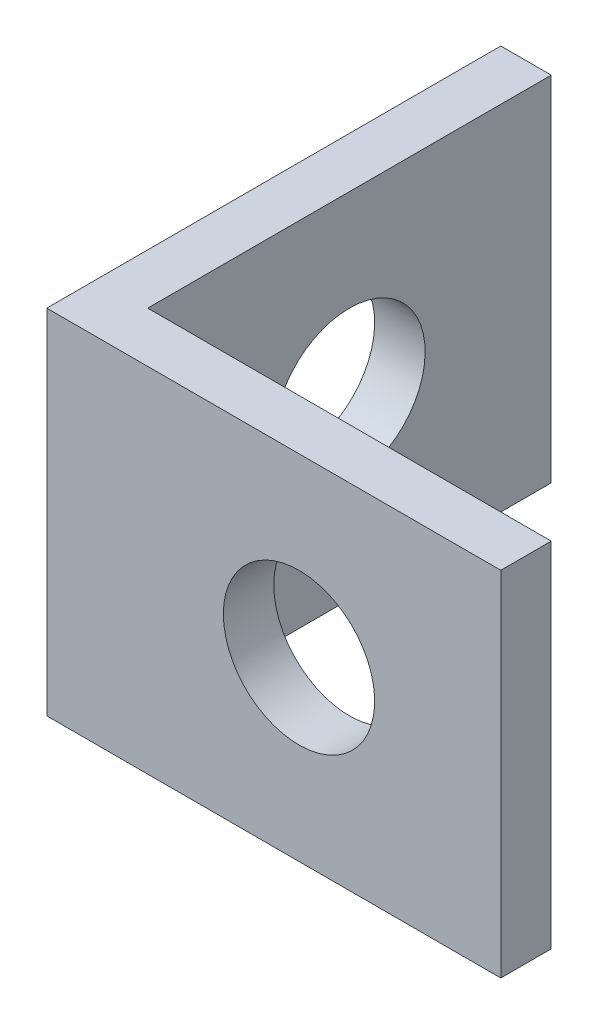
ISO-10303-21;
HEADER;
FILE_DESCRIPTION(('STEP AP214'),'2;1');
FILE_NAME('part.step','',(''),(''),'','','');
FILE_SCHEMA(('AUTOMOTIVE_DESIGN { 1 0 10303 214 1 1 1 1 }'));
ENDSEC;
DATA;
#1=APPLICATION_CONTEXT('core data for automotive mechanical design processes');
#2=APPLICATION_PROTOCOL_DEFINITION('international standard','automotive_design',2000,#1);
#3=PRODUCT_CONTEXT('',#1,'mechanical');
#4=PRODUCT('Part','Part','',(#3));
#5=PRODUCT_RELATED_PRODUCT_CATEGORY('part','',(#4));
#6=PRODUCT_DEFINITION_FORMATION('','',#4);
#7=PRODUCT_DEFINITION_CONTEXT('part definition',#1,'design');
#8=PRODUCT_DEFINITION('design','',#6,#7);
#9=PRODUCT_DEFINITION_SHAPE('','',#8);
#10=(LENGTH_UNIT() NAMED_UNIT(*) SI_UNIT(.MILLI.,.METRE.));
#11=(NAMED_UNIT(*) PLANE_ANGLE_UNIT() SI_UNIT($,.RADIAN.));
#12=(NAMED_UNIT(*) SI_UNIT($,.STERADIAN.) SOLID_ANGLE_UNIT());
#13=UNCERTAINTY_MEASURE_WITH_UNIT(LENGTH_MEASURE(1.E-05),#10,'distance_accuracy_value','');
#14=(GEOMETRIC_REPRESENTATION_CONTEXT(3) GLOBAL_UNCERTAINTY_ASSIGNED_CONTEXT((#13)) GLOBAL_UNIT_ASSIGNED_CONTEXT((#10,
#11,#12)) REPRESENTATION_CONTEXT('',''));
#15=CARTESIAN_POINT('',(0.,0.,0.));
#16=DIRECTION('',(0.,0.,1.));
#17=DIRECTION('',(1.,0.,0.));
#18=AXIS2_PLACEMENT_3D('',#15,#16,#17);
#19=CARTESIAN_POINT('',(-4.,0.,1.));
#20=DIRECTION('',(0.,1.,0.));
#21=DIRECTION('',(-1.,0.,0.));
#22=AXIS2_PLACEMENT_3D('',#19,#20,#21);
#23=PLANE('',#22);
#24=DIRECTION('',(1.,0.,0.));
#25=VECTOR('',#24,1.);
#26=CARTESIAN_POINT('',(-4.,0.,0.));
#27=LINE('',#26,#25);
#28=CARTESIAN_POINT('',(-4.,0.,0.));
#29=VERTEX_POINT('',#28);
#30=CARTESIAN_POINT('',(4.,0.,0.));
#31=VERTEX_POINT('',#30);
#32=EDGE_CURVE('E91',#29,#31,#27,.T.);
#33=ORIENTED_EDGE('',*,*,#32,.T.);
#34=DIRECTION('',(0.,0.,-1.));
#35=VECTOR('',#34,1.);
#36=CARTESIAN_POINT('',(4.,0.,1.));
#37=LINE('',#36,#35);
#38=CARTESIAN_POINT('',(4.,0.,1.));
#39=VERTEX_POINT('',#38);
#40=EDGE_CURVE('E11',#39,#31,#37,.T.);
#41=ORIENTED_EDGE('',*,*,#40,.F.);
#42=DIRECTION('',(1.,0.,0.));
#43=VECTOR('',#42,1.);
#44=CARTESIAN_POINT('',(-4.,0.,1.));
#45=LINE('',#44,#43);
#46=CARTESIAN_POINT('',(-5.,0.,1.));
#47=VERTEX_POINT('',#46);
#48=EDGE_CURVE('E85',#47,#39,#45,.T.);
#49=ORIENTED_EDGE('',*,*,#48,.F.);
#50=DIRECTION('',(0.,0.,1.));
#51=VECTOR('',#50,1.);
#52=CARTESIAN_POINT('',(-5.,0.,-8.));
#53=LINE('',#52,#51);
#54=CARTESIAN_POINT('',(-5.,0.,-8.));
#55=VERTEX_POINT('',#54);
#56=EDGE_CURVE('E109',#55,#47,#53,.T.);
#57=ORIENTED_EDGE('',*,*,#56,.F.);
#58=DIRECTION('',(1.,0.,0.));
#59=VECTOR('',#58,1.);
#60=CARTESIAN_POINT('',(-4.,0.,-8.));
#61=LINE('',#60,#59);
#62=CARTESIAN_POINT('',(-4.,0.,-8.));
#63=VERTEX_POINT('',#62);
#64=EDGE_CURVE('E104',#55,#63,#61,.T.);
#65=ORIENTED_EDGE('',*,*,#64,.T.);
#66=DIRECTION('',(0.,0.,1.));
#67=VECTOR('',#66,1.);
#68=CARTESIAN_POINT('',(-4.,0.,-8.));
#69=LINE('',#68,#67);
#70=EDGE_CURVE('E96',#63,#29,#69,.T.);
#71=ORIENTED_EDGE('',*,*,#70,.T.);
#72=EDGE_LOOP('',(#33,#41,#49,#57,#65,#71));
#73=FACE_BOUND('',#72,.T.);
#74=ADVANCED_FACE('F39',(#73),#23,.F.);
#75=CARTESIAN_POINT('',(4.,7.,1.));
#76=DIRECTION('',(-1.,0.,0.));
#77=DIRECTION('',(0.,-1.,0.));
#78=AXIS2_PLACEMENT_3D('',#75,#76,#77);
#79=PLANE('',#78);
#80=DIRECTION('',(0.,1.,0.));
#81=VECTOR('',#80,1.);
#82=CARTESIAN_POINT('',(4.,7.,0.));
#83=LINE('',#82,#81);
#84=CARTESIAN_POINT('',(4.,7.,0.));
#85=VERTEX_POINT('',#84);
#86=EDGE_CURVE('E68',#31,#85,#83,.T.);
#87=ORIENTED_EDGE('',*,*,#86,.T.);
#88=DIRECTION('',(0.,0.,-1.));
#89=VECTOR('',#88,1.);
#90=CARTESIAN_POINT('',(4.,7.,1.));
#91=LINE('',#90,#89);
#92=CARTESIAN_POINT('',(4.,7.,1.));
#93=VERTEX_POINT('',#92);
#94=EDGE_CURVE('E48',#93,#85,#91,.T.);
#95=ORIENTED_EDGE('',*,*,#94,.F.);
#96=DIRECTION('',(0.,1.,0.));
#97=VECTOR('',#96,1.);
#98=CARTESIAN_POINT('',(4.,7.,1.));
#99=LINE('',#98,#97);
#100=EDGE_CURVE('E56',#39,#93,#99,.T.);
#101=ORIENTED_EDGE('',*,*,#100,.F.);
#102=ORIENTED_EDGE('',*,*,#40,.T.);
#103=EDGE_LOOP('',(#87,#95,#101,#102));
#104=FACE_BOUND('',#103,.T.);
#105=ADVANCED_FACE('F186',(#104),#79,.F.);
#106=CARTESIAN_POINT('',(-4.,7.,1.));
#107=DIRECTION('',(0.,-1.,0.));
#108=DIRECTION('',(1.,0.,0.));
#109=AXIS2_PLACEMENT_3D('',#106,#107,#108);
#110=PLANE('',#109);
#111=DIRECTION('',(-1.,0.,0.));
#112=VECTOR('',#111,1.);
#113=CARTESIAN_POINT('',(-4.,7.,0.));
#114=LINE('',#113,#112);
#115=CARTESIAN_POINT('',(-4.,7.,0.));
#116=VERTEX_POINT('',#115);
#117=EDGE_CURVE('E74',#85,#116,#114,.T.);
#118=ORIENTED_EDGE('',*,*,#117,.T.);
#119=DIRECTION('',(0.,0.,1.));
#120=VECTOR('',#119,1.);
#121=CARTESIAN_POINT('',(-4.,7.,-8.));
#122=LINE('',#121,#120);
#123=CARTESIAN_POINT('',(-4.,7.,-8.));
#124=VERTEX_POINT('',#123);
#125=EDGE_CURVE('E80',#124,#116,#122,.T.);
#126=ORIENTED_EDGE('',*,*,#125,.F.);
#127=DIRECTION('',(-1.,0.,0.));
#128=VECTOR('',#127,1.);
#129=CARTESIAN_POINT('',(-4.,7.,-8.));
#130=LINE('',#129,#128);
#131=CARTESIAN_POINT('',(-5.,7.,-8.));
#132=VERTEX_POINT('',#131);
#133=EDGE_CURVE('E144',#124,#132,#130,.T.);
#134=ORIENTED_EDGE('',*,*,#133,.T.);
#135=DIRECTION('',(0.,0.,1.));
#136=VECTOR('',#135,1.);
#137=CARTESIAN_POINT('',(-5.,7.,-8.));
#138=LINE('',#137,#136);
#139=CARTESIAN_POINT('',(-5.,7.,1.));
#140=VERTEX_POINT('',#139);
#141=EDGE_CURVE('E103',#132,#140,#138,.T.);
#142=ORIENTED_EDGE('',*,*,#141,.T.);
#143=DIRECTION('',(-1.,0.,0.));
#144=VECTOR('',#143,1.);
#145=CARTESIAN_POINT('',(-4.,7.,1.));
#146=LINE('',#145,#144);
#147=EDGE_CURVE('E120',#93,#140,#146,.T.);
#148=ORIENTED_EDGE('',*,*,#147,.F.);
#149=ORIENTED_EDGE('',*,*,#94,.T.);
#150=EDGE_LOOP('',(#118,#126,#134,#142,#148,#149));
#151=FACE_BOUND('',#150,.T.);
#152=ADVANCED_FACE('F76',(#151),#110,.F.);
#153=CARTESIAN_POINT('',(0.,0.,1.));
#154=DIRECTION('',(0.,0.,1.));
#155=DIRECTION('',(1.,0.,0.));
#156=AXIS2_PLACEMENT_3D('',#153,#154,#155);
#157=PLANE('',#156);
#158=CARTESIAN_POINT('',(0.,3.5,1.));
#159=DIRECTION('',(0.,0.,-1.));
#160=DIRECTION('',(-1.,0.,0.));
#161=AXIS2_PLACEMENT_3D('',#158,#159,#160);
#162=CIRCLE('',#161,1.5);
#163=CARTESIAN_POINT('',(-1.5,3.5,1.));
#164=VERTEX_POINT('',#163);
#165=EDGE_CURVE('E153',#164,#164,#162,.T.);
#166=ORIENTED_EDGE('',*,*,#165,.T.);
#167=EDGE_LOOP('',(#166));
#168=FACE_BOUND('',#167,.T.);
#169=ORIENTED_EDGE('',*,*,#147,.T.);
#170=DIRECTION('',(0.,-1.,0.));
#171=VECTOR('',#170,1.);
#172=CARTESIAN_POINT('',(-5.,7.,1.));
#173=LINE('',#172,#171);
#174=EDGE_CURVE('E138',#140,#47,#173,.T.);
#175=ORIENTED_EDGE('',*,*,#174,.T.);
#176=ORIENTED_EDGE('',*,*,#48,.T.);
#177=ORIENTED_EDGE('',*,*,#100,.T.);
#178=EDGE_LOOP('',(#169,#175,#176,#177));
#179=FACE_BOUND('',#178,.T.);
#180=ADVANCED_FACE('F165',(#168,#179),#157,.T.);
#181=CARTESIAN_POINT('',(0.,0.,0.));
#182=DIRECTION('',(0.,0.,1.));
#183=DIRECTION('',(1.,0.,0.));
#184=AXIS2_PLACEMENT_3D('',#181,#182,#183);
#185=PLANE('',#184);
#186=CARTESIAN_POINT('',(0.,3.5,0.));
#187=DIRECTION('',(0.,0.,-1.));
#188=DIRECTION('',(-1.,0.,0.));
#189=AXIS2_PLACEMENT_3D('',#186,#187,#188);
#190=CIRCLE('',#189,1.5);
#191=CARTESIAN_POINT('',(-1.5,3.5,0.));
#192=VERTEX_POINT('',#191);
#193=EDGE_CURVE('E157',#192,#192,#190,.T.);
#194=ORIENTED_EDGE('',*,*,#193,.F.);
#195=EDGE_LOOP('',(#194));
#196=FACE_BOUND('',#195,.T.);
#197=DIRECTION('',(0.,-1.,0.));
#198=VECTOR('',#197,1.);
#199=CARTESIAN_POINT('',(-4.,7.,0.));
#200=LINE('',#199,#198);
#201=EDGE_CURVE('E89',#116,#29,#200,.T.);
#202=ORIENTED_EDGE('',*,*,#201,.F.);
#203=ORIENTED_EDGE('',*,*,#117,.F.);
#204=ORIENTED_EDGE('',*,*,#86,.F.);
#205=ORIENTED_EDGE('',*,*,#32,.F.);
#206=EDGE_LOOP('',(#202,#203,#204,#205));
#207=FACE_BOUND('',#206,.T.);
#208=ADVANCED_FACE('F90',(#196,#207),#185,.F.);
#209=CARTESIAN_POINT('',(-4.,7.,-8.));
#210=DIRECTION('',(1.,0.,0.));
#211=DIRECTION('',(0.,1.,0.));
#212=AXIS2_PLACEMENT_3D('',#209,#210,#211);
#213=PLANE('',#212);
#214=CARTESIAN_POINT('',(-4.,3.5,-4.));
#215=DIRECTION('',(1.,0.,0.));
#216=DIRECTION('',(0.,1.,0.));
#217=AXIS2_PLACEMENT_3D('',#214,#215,#216);
#218=CIRCLE('',#217,1.5);
#219=CARTESIAN_POINT('',(-4.,5.,-4.));
#220=VERTEX_POINT('',#219);
#221=EDGE_CURVE('E149',#220,#220,#218,.T.);
#222=ORIENTED_EDGE('',*,*,#221,.F.);
#223=EDGE_LOOP('',(#222));
#224=FACE_BOUND('',#223,.T.);
#225=ORIENTED_EDGE('',*,*,#125,.T.);
#226=ORIENTED_EDGE('',*,*,#201,.T.);
#227=ORIENTED_EDGE('',*,*,#70,.F.);
#228=DIRECTION('',(0.,1.,0.));
#229=VECTOR('',#228,1.);
#230=CARTESIAN_POINT('',(-4.,7.,-8.));
#231=LINE('',#230,#229);
#232=EDGE_CURVE('E101',#63,#124,#231,.T.);
#233=ORIENTED_EDGE('',*,*,#232,.T.);
#234=EDGE_LOOP('',(#225,#226,#227,#233));
#235=FACE_BOUND('',#234,.T.);
#236=ADVANCED_FACE('F99',(#224,#235),#213,.T.);
#237=CARTESIAN_POINT('',(-5.,7.,-8.));
#238=DIRECTION('',(-1.,0.,0.));
#239=DIRECTION('',(0.,0.,1.));
#240=AXIS2_PLACEMENT_3D('',#237,#238,#239);
#241=PLANE('',#240);
#242=CARTESIAN_POINT('',(-5.,3.5,-4.));
#243=DIRECTION('',(1.,0.,0.));
#244=DIRECTION('',(0.,1.,0.));
#245=AXIS2_PLACEMENT_3D('',#242,#243,#244);
#246=CIRCLE('',#245,1.5);
#247=CARTESIAN_POINT('',(-5.,5.,-4.));
#248=VERTEX_POINT('',#247);
#249=EDGE_CURVE('E140',#248,#248,#246,.T.);
#250=ORIENTED_EDGE('',*,*,#249,.T.);
#251=EDGE_LOOP('',(#250));
#252=FACE_BOUND('',#251,.T.);
#253=ORIENTED_EDGE('',*,*,#174,.F.);
#254=ORIENTED_EDGE('',*,*,#141,.F.);
#255=DIRECTION('',(0.,-1.,0.));
#256=VECTOR('',#255,1.);
#257=CARTESIAN_POINT('',(-5.,7.,-8.));
#258=LINE('',#257,#256);
#259=EDGE_CURVE('E112',#132,#55,#258,.T.);
#260=ORIENTED_EDGE('',*,*,#259,.T.);
#261=ORIENTED_EDGE('',*,*,#56,.T.);
#262=EDGE_LOOP('',(#253,#254,#260,#261));
#263=FACE_BOUND('',#262,.T.);
#264=ADVANCED_FACE('F180',(#252,#263),#241,.T.);
#265=CARTESIAN_POINT('',(0.,0.,-8.));
#266=DIRECTION('',(0.,0.,-1.));
#267=DIRECTION('',(-1.,0.,0.));
#268=AXIS2_PLACEMENT_3D('',#265,#266,#267);
#269=PLANE('',#268);
#270=ORIENTED_EDGE('',*,*,#232,.F.);
#271=ORIENTED_EDGE('',*,*,#64,.F.);
#272=ORIENTED_EDGE('',*,*,#259,.F.);
#273=ORIENTED_EDGE('',*,*,#133,.F.);
#274=EDGE_LOOP('',(#270,#271,#272,#273));
#275=FACE_BOUND('',#274,.T.);
#276=ADVANCED_FACE('F207',(#275),#269,.T.);
#277=CARTESIAN_POINT('',(-5.,3.5,-4.));
#278=DIRECTION('',(1.,0.,0.));
#279=DIRECTION('',(0.,1.,0.));
#280=AXIS2_PLACEMENT_3D('',#277,#278,#279);
#281=CYLINDRICAL_SURFACE('',#280,1.5);
#282=ORIENTED_EDGE('',*,*,#249,.F.);
#283=EDGE_LOOP('',(#282));
#284=FACE_BOUND('',#283,.T.);
#285=ORIENTED_EDGE('',*,*,#221,.T.);
#286=EDGE_LOOP('',(#285));
#287=FACE_BOUND('',#286,.T.);
#288=ADVANCED_FACE('F170',(#284,#287),#281,.F.);
#289=CARTESIAN_POINT('',(0.,3.5,1.));
#290=DIRECTION('',(0.,0.,-1.));
#291=DIRECTION('',(-1.,0.,0.));
#292=AXIS2_PLACEMENT_3D('',#289,#290,#291);
#293=CYLINDRICAL_SURFACE('',#292,1.5);
#294=ORIENTED_EDGE('',*,*,#165,.F.);
#295=EDGE_LOOP('',(#294));
#296=FACE_BOUND('',#295,.T.);
#297=ORIENTED_EDGE('',*,*,#193,.T.);
#298=EDGE_LOOP('',(#297));
#299=FACE_BOUND('',#298,.T.);
#300=ADVANCED_FACE('F167',(#296,#299),#293,.F.);
#301=CLOSED_SHELL('',(#74,#105,#152,#180,#208,#236,#264,#276,#288,#300));
#302=MANIFOLD_SOLID_BREP('B2',#301);
#303=ADVANCED_BREP_SHAPE_REPRESENTATION('',(#18,#302),#14);
#304=SHAPE_DEFINITION_REPRESENTATION(#9,#303);
ENDSEC;
END-ISO-10303-21;
